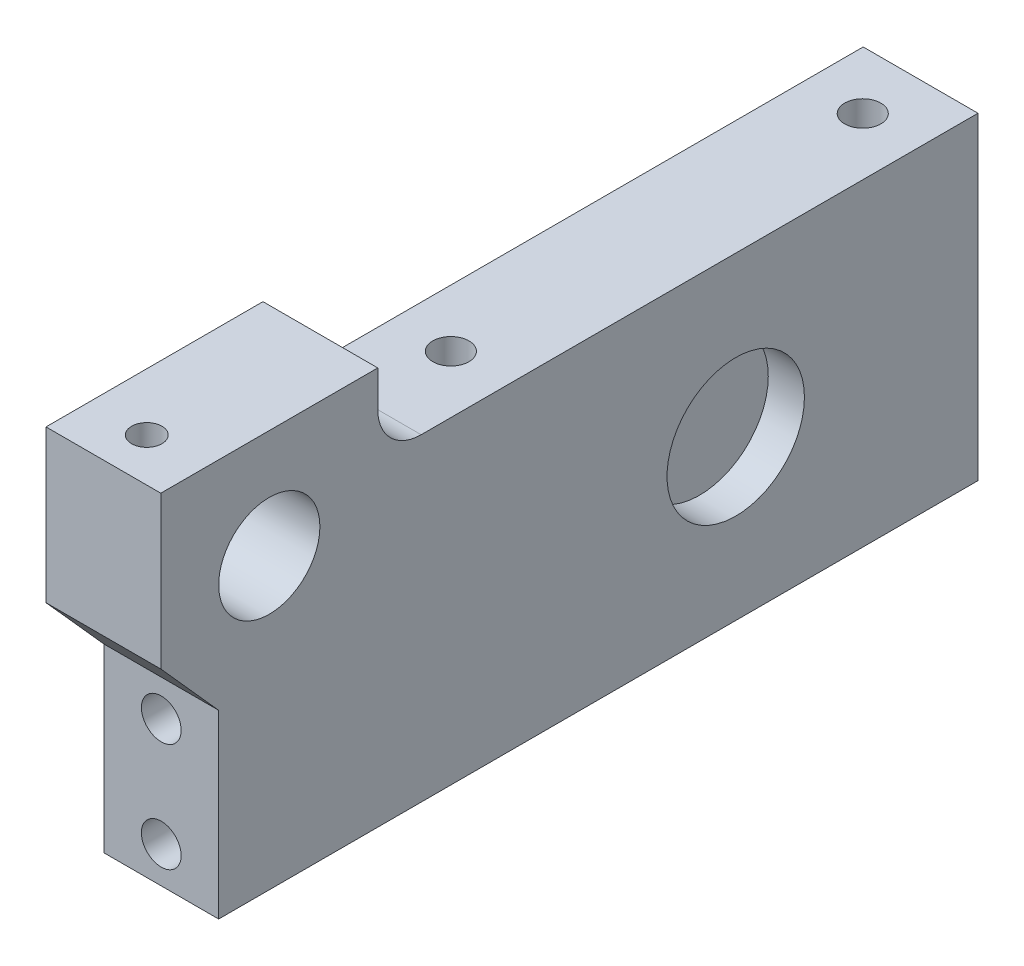
ISO-10303-21;
HEADER;
FILE_DESCRIPTION(('STEP AP214'),'2;1');
FILE_NAME('part.step','',(''),(''),'','','');
FILE_SCHEMA(('AUTOMOTIVE_DESIGN { 1 0 10303 214 1 1 1 1 }'));
ENDSEC;
DATA;
#1=APPLICATION_CONTEXT('core data for automotive mechanical design processes');
#2=APPLICATION_PROTOCOL_DEFINITION('international standard','automotive_design',2000,#1);
#3=PRODUCT_CONTEXT('',#1,'mechanical');
#4=PRODUCT('Part','Part','',(#3));
#5=PRODUCT_RELATED_PRODUCT_CATEGORY('part','',(#4));
#6=PRODUCT_DEFINITION_FORMATION('','',#4);
#7=PRODUCT_DEFINITION_CONTEXT('part definition',#1,'design');
#8=PRODUCT_DEFINITION('design','',#6,#7);
#9=PRODUCT_DEFINITION_SHAPE('','',#8);
#10=(LENGTH_UNIT() NAMED_UNIT(*) SI_UNIT(.MILLI.,.METRE.));
#11=(NAMED_UNIT(*) PLANE_ANGLE_UNIT() SI_UNIT($,.RADIAN.));
#12=(NAMED_UNIT(*) SI_UNIT($,.STERADIAN.) SOLID_ANGLE_UNIT());
#13=UNCERTAINTY_MEASURE_WITH_UNIT(LENGTH_MEASURE(1.E-05),#10,'distance_accuracy_value','');
#14=(GEOMETRIC_REPRESENTATION_CONTEXT(3) GLOBAL_UNCERTAINTY_ASSIGNED_CONTEXT((#13)) GLOBAL_UNIT_ASSIGNED_CONTEXT((#10,
#11,#12)) REPRESENTATION_CONTEXT('',''));
#15=CARTESIAN_POINT('',(0.,0.,0.));
#16=DIRECTION('',(0.,0.,1.));
#17=DIRECTION('',(1.,0.,0.));
#18=AXIS2_PLACEMENT_3D('',#15,#16,#17);
#19=CARTESIAN_POINT('',(7.9375,0.,40.));
#20=DIRECTION('',(0.,0.,1.));
#21=DIRECTION('',(1.,0.,0.));
#22=AXIS2_PLACEMENT_3D('',#19,#20,#21);
#23=PLANE('',#22);
#24=DIRECTION('',(0.,1.,0.));
#25=VECTOR('',#24,1.);
#26=CARTESIAN_POINT('',(-7.9375,0.,40.));
#27=LINE('',#26,#25);
#28=CARTESIAN_POINT('',(-7.9375,17.4442719099992,40.));
#29=VERTEX_POINT('',#28);
#30=CARTESIAN_POINT('',(-7.9375,38.5,40.));
#31=VERTEX_POINT('',#30);
#32=EDGE_CURVE('E210',#29,#31,#27,.T.);
#33=ORIENTED_EDGE('',*,*,#32,.F.);
#34=DIRECTION('',(-1.,0.,0.));
#35=VECTOR('',#34,1.);
#36=CARTESIAN_POINT('',(7.9375,17.4442719099992,40.));
#37=LINE('',#36,#35);
#38=CARTESIAN_POINT('',(7.9375,17.4442719099992,40.));
#39=VERTEX_POINT('',#38);
#40=EDGE_CURVE('E246',#39,#29,#37,.T.);
#41=ORIENTED_EDGE('',*,*,#40,.F.);
#42=DIRECTION('',(0.,1.,0.));
#43=VECTOR('',#42,1.);
#44=CARTESIAN_POINT('',(7.9375,0.,40.));
#45=LINE('',#44,#43);
#46=CARTESIAN_POINT('',(7.9375,38.5,40.));
#47=VERTEX_POINT('',#46);
#48=EDGE_CURVE('E184',#39,#47,#45,.T.);
#49=ORIENTED_EDGE('',*,*,#48,.T.);
#50=DIRECTION('',(-1.,0.,0.));
#51=VECTOR('',#50,1.);
#52=CARTESIAN_POINT('',(7.9375,38.5,40.));
#53=LINE('',#52,#51);
#54=EDGE_CURVE('E206',#47,#31,#53,.T.);
#55=ORIENTED_EDGE('',*,*,#54,.T.);
#56=EDGE_LOOP('',(#33,#41,#49,#55));
#57=FACE_BOUND('',#56,.T.);
#58=ADVANCED_FACE('F35',(#57),#23,.T.);
#59=CARTESIAN_POINT('',(7.9375,-12.1231500622207,13.5540938202782));
#60=DIRECTION('',(0.,-0.666666666666667,0.74535599249993));
#61=DIRECTION('',(0.,-0.74535599249993,-0.666666666666667));
#62=AXIS2_PLACEMENT_3D('',#59,#60,#61);
#63=PLANE('',#62);
#64=DIRECTION('',(0.,0.74535599249993,0.666666666666667));
#65=VECTOR('',#64,1.);
#66=CARTESIAN_POINT('',(-7.9375,-12.1231500622207,13.5540938202782));
#67=LINE('',#66,#65);
#68=CARTESIAN_POINT('',(-7.9375,8.5,32.));
#69=VERTEX_POINT('',#68);
#70=EDGE_CURVE('E213',#69,#29,#67,.T.);
#71=ORIENTED_EDGE('',*,*,#70,.F.);
#72=DIRECTION('',(-1.,0.,0.));
#73=VECTOR('',#72,1.);
#74=CARTESIAN_POINT('',(7.9375,8.5,32.));
#75=LINE('',#74,#73);
#76=CARTESIAN_POINT('',(7.9375,8.5,32.));
#77=VERTEX_POINT('',#76);
#78=EDGE_CURVE('E244',#77,#69,#75,.T.);
#79=ORIENTED_EDGE('',*,*,#78,.F.);
#80=DIRECTION('',(0.,0.74535599249993,0.666666666666667));
#81=VECTOR('',#80,1.);
#82=CARTESIAN_POINT('',(7.9375,-12.1231500622207,13.5540938202782));
#83=LINE('',#82,#81);
#84=EDGE_CURVE('E188',#77,#39,#83,.T.);
#85=ORIENTED_EDGE('',*,*,#84,.T.);
#86=ORIENTED_EDGE('',*,*,#40,.T.);
#87=EDGE_LOOP('',(#71,#79,#85,#86));
#88=FACE_BOUND('',#87,.T.);
#89=ADVANCED_FACE('F355',(#88),#63,.T.);
#90=CARTESIAN_POINT('',(7.9375,0.,32.));
#91=DIRECTION('',(0.,0.,-1.));
#92=DIRECTION('',(-1.,0.,0.));
#93=AXIS2_PLACEMENT_3D('',#90,#91,#92);
#94=PLANE('',#93);
#95=CARTESIAN_POINT('',(0.,3.49999999999996,32.));
#96=DIRECTION('',(0.,0.,-1.));
#97=DIRECTION('',(-1.,0.,0.));
#98=AXIS2_PLACEMENT_3D('',#95,#96,#97);
#99=CIRCLE('',#98,2.74999999999997);
#100=CARTESIAN_POINT('',(-2.74999999999997,3.49999999999996,32.));
#101=VERTEX_POINT('',#100);
#102=EDGE_CURVE('E176',#101,#101,#99,.T.);
#103=ORIENTED_EDGE('',*,*,#102,.T.);
#104=EDGE_LOOP('',(#103));
#105=FACE_BOUND('',#104,.T.);
#106=CARTESIAN_POINT('',(0.,-11.5,32.));
#107=DIRECTION('',(0.,0.,-1.));
#108=DIRECTION('',(-1.,0.,0.));
#109=AXIS2_PLACEMENT_3D('',#106,#107,#108);
#110=CIRCLE('',#109,2.74999999999997);
#111=CARTESIAN_POINT('',(-2.74999999999997,-11.5,32.));
#112=VERTEX_POINT('',#111);
#113=EDGE_CURVE('E180',#112,#112,#110,.T.);
#114=ORIENTED_EDGE('',*,*,#113,.T.);
#115=EDGE_LOOP('',(#114));
#116=FACE_BOUND('',#115,.T.);
#117=DIRECTION('',(0.,-1.,0.));
#118=VECTOR('',#117,1.);
#119=CARTESIAN_POINT('',(-7.9375,0.,32.));
#120=LINE('',#119,#118);
#121=CARTESIAN_POINT('',(-7.9375,-16.5,32.));
#122=VERTEX_POINT('',#121);
#123=EDGE_CURVE('E216',#69,#122,#120,.T.);
#124=ORIENTED_EDGE('',*,*,#123,.T.);
#125=DIRECTION('',(-1.,0.,0.));
#126=VECTOR('',#125,1.);
#127=CARTESIAN_POINT('',(7.9375,-16.5,32.));
#128=LINE('',#127,#126);
#129=CARTESIAN_POINT('',(7.9375,-16.5,32.));
#130=VERTEX_POINT('',#129);
#131=EDGE_CURVE('E241',#130,#122,#128,.T.);
#132=ORIENTED_EDGE('',*,*,#131,.F.);
#133=DIRECTION('',(0.,-1.,0.));
#134=VECTOR('',#133,1.);
#135=CARTESIAN_POINT('',(7.9375,0.,32.));
#136=LINE('',#135,#134);
#137=EDGE_CURVE('E191',#77,#130,#136,.T.);
#138=ORIENTED_EDGE('',*,*,#137,.F.);
#139=ORIENTED_EDGE('',*,*,#78,.T.);
#140=EDGE_LOOP('',(#124,#132,#138,#139));
#141=FACE_BOUND('',#140,.T.);
#142=ADVANCED_FACE('F351',(#105,#116,#141),#94,.F.);
#143=CARTESIAN_POINT('',(7.9375,-16.5,0.));
#144=DIRECTION('',(0.,1.,0.));
#145=DIRECTION('',(0.,0.,1.));
#146=AXIS2_PLACEMENT_3D('',#143,#144,#145);
#147=PLANE('',#146);
#148=CARTESIAN_POINT('',(0.00250000000007189,-16.5,-65.));
#149=DIRECTION('',(0.,1.,0.));
#150=DIRECTION('',(0.,0.,1.));
#151=AXIS2_PLACEMENT_3D('',#148,#149,#150);
#152=CIRCLE('',#151,3.29999999999999);
#153=CARTESIAN_POINT('',(0.00250000000007189,-16.5,-61.7));
#154=VERTEX_POINT('',#153);
#155=EDGE_CURVE('E168',#154,#154,#152,.T.);
#156=ORIENTED_EDGE('',*,*,#155,.T.);
#157=EDGE_LOOP('',(#156));
#158=FACE_BOUND('',#157,.T.);
#159=CARTESIAN_POINT('',(0.00250000000007883,-16.5,-8.04672113487742));
#160=DIRECTION('',(0.,1.,0.));
#161=DIRECTION('',(0.,0.,1.));
#162=AXIS2_PLACEMENT_3D('',#159,#160,#161);
#163=CIRCLE('',#162,3.29999999999999);
#164=CARTESIAN_POINT('',(0.00250000000007883,-16.5,-4.74672113487743));
#165=VERTEX_POINT('',#164);
#166=EDGE_CURVE('E172',#165,#165,#163,.T.);
#167=ORIENTED_EDGE('',*,*,#166,.T.);
#168=EDGE_LOOP('',(#167));
#169=FACE_BOUND('',#168,.T.);
#170=DIRECTION('',(0.,0.,-1.));
#171=VECTOR('',#170,1.);
#172=CARTESIAN_POINT('',(-7.9375,-16.5,0.));
#173=LINE('',#172,#171);
#174=CARTESIAN_POINT('',(-7.9375,-16.5,-73.));
#175=VERTEX_POINT('',#174);
#176=EDGE_CURVE('E219',#122,#175,#173,.T.);
#177=ORIENTED_EDGE('',*,*,#176,.T.);
#178=DIRECTION('',(-1.,0.,0.));
#179=VECTOR('',#178,1.);
#180=CARTESIAN_POINT('',(7.9375,-16.5,-73.));
#181=LINE('',#180,#179);
#182=CARTESIAN_POINT('',(7.9375,-16.5,-73.));
#183=VERTEX_POINT('',#182);
#184=EDGE_CURVE('E238',#183,#175,#181,.T.);
#185=ORIENTED_EDGE('',*,*,#184,.F.);
#186=DIRECTION('',(0.,0.,-1.));
#187=VECTOR('',#186,1.);
#188=CARTESIAN_POINT('',(7.9375,-16.5,0.));
#189=LINE('',#188,#187);
#190=EDGE_CURVE('E194',#130,#183,#189,.T.);
#191=ORIENTED_EDGE('',*,*,#190,.F.);
#192=ORIENTED_EDGE('',*,*,#131,.T.);
#193=EDGE_LOOP('',(#177,#185,#191,#192));
#194=FACE_BOUND('',#193,.T.);
#195=ADVANCED_FACE('F347',(#158,#169,#194),#147,.F.);
#196=CARTESIAN_POINT('',(7.9375,0.,-73.));
#197=DIRECTION('',(0.,0.,1.));
#198=DIRECTION('',(1.,0.,0.));
#199=AXIS2_PLACEMENT_3D('',#196,#197,#198);
#200=PLANE('',#199);
#201=DIRECTION('',(0.,1.,0.));
#202=VECTOR('',#201,1.);
#203=CARTESIAN_POINT('',(-7.9375,0.,-73.));
#204=LINE('',#203,#202);
#205=CARTESIAN_POINT('',(-7.9375,27.5,-73.));
#206=VERTEX_POINT('',#205);
#207=EDGE_CURVE('E222',#175,#206,#204,.T.);
#208=ORIENTED_EDGE('',*,*,#207,.T.);
#209=DIRECTION('',(-1.,0.,0.));
#210=VECTOR('',#209,1.);
#211=CARTESIAN_POINT('',(7.9375,27.5,-73.));
#212=LINE('',#211,#210);
#213=CARTESIAN_POINT('',(7.9375,27.5,-73.));
#214=VERTEX_POINT('',#213);
#215=EDGE_CURVE('E235',#214,#206,#212,.T.);
#216=ORIENTED_EDGE('',*,*,#215,.F.);
#217=DIRECTION('',(0.,1.,0.));
#218=VECTOR('',#217,1.);
#219=CARTESIAN_POINT('',(7.9375,0.,-73.));
#220=LINE('',#219,#218);
#221=EDGE_CURVE('E197',#183,#214,#220,.T.);
#222=ORIENTED_EDGE('',*,*,#221,.F.);
#223=ORIENTED_EDGE('',*,*,#184,.T.);
#224=EDGE_LOOP('',(#208,#216,#222,#223));
#225=FACE_BOUND('',#224,.T.);
#226=ADVANCED_FACE('F343',(#225),#200,.F.);
#227=CARTESIAN_POINT('',(7.9375,27.5,0.));
#228=DIRECTION('',(0.,1.,0.));
#229=DIRECTION('',(0.,0.,1.));
#230=AXIS2_PLACEMENT_3D('',#227,#228,#229);
#231=PLANE('',#230);
#232=CARTESIAN_POINT('',(0.00250000000002332,27.5,-65.));
#233=DIRECTION('',(0.,1.,0.));
#234=DIRECTION('',(0.,0.,1.));
#235=AXIS2_PLACEMENT_3D('',#232,#233,#234);
#236=CIRCLE('',#235,2.5);
#237=CARTESIAN_POINT('',(0.00250000000002332,27.5,-62.5));
#238=VERTEX_POINT('',#237);
#239=EDGE_CURVE('E145',#238,#238,#236,.T.);
#240=ORIENTED_EDGE('',*,*,#239,.F.);
#241=EDGE_LOOP('',(#240));
#242=FACE_BOUND('',#241,.T.);
#243=CARTESIAN_POINT('',(0.00250000000007883,27.5,-8.04672113488112));
#244=DIRECTION('',(0.,1.,0.));
#245=DIRECTION('',(0.,0.,1.));
#246=AXIS2_PLACEMENT_3D('',#243,#244,#245);
#247=CIRCLE('',#246,2.5);
#248=CARTESIAN_POINT('',(0.00250000000007883,27.5,-5.54672113488112));
#249=VERTEX_POINT('',#248);
#250=EDGE_CURVE('E144',#249,#249,#247,.T.);
#251=ORIENTED_EDGE('',*,*,#250,.F.);
#252=EDGE_LOOP('',(#251));
#253=FACE_BOUND('',#252,.T.);
#254=DIRECTION('',(0.,0.,-1.));
#255=VECTOR('',#254,1.);
#256=CARTESIAN_POINT('',(-7.9375,27.5,0.));
#257=LINE('',#256,#255);
#258=CARTESIAN_POINT('',(-7.9375,27.5,4.00000000000002));
#259=VERTEX_POINT('',#258);
#260=EDGE_CURVE('E225',#259,#206,#257,.T.);
#261=ORIENTED_EDGE('',*,*,#260,.F.);
#262=DIRECTION('',(-1.,0.,0.));
#263=VECTOR('',#262,1.);
#264=CARTESIAN_POINT('',(7.9375,27.5,4.00000000000002));
#265=LINE('',#264,#263);
#266=CARTESIAN_POINT('',(7.9375,27.5,4.00000000000002));
#267=VERTEX_POINT('',#266);
#268=EDGE_CURVE('E51',#259,#267,#265,.F.);
#269=ORIENTED_EDGE('',*,*,#268,.T.);
#270=DIRECTION('',(0.,0.,-1.));
#271=VECTOR('',#270,1.);
#272=CARTESIAN_POINT('',(7.9375,27.5,0.));
#273=LINE('',#272,#271);
#274=EDGE_CURVE('E200',#267,#214,#273,.T.);
#275=ORIENTED_EDGE('',*,*,#274,.T.);
#276=ORIENTED_EDGE('',*,*,#215,.T.);
#277=EDGE_LOOP('',(#261,#269,#275,#276));
#278=FACE_BOUND('',#277,.T.);
#279=ADVANCED_FACE('F339',(#242,#253,#278),#231,.T.);
#280=CARTESIAN_POINT('',(7.9375,0.,10.));
#281=DIRECTION('',(0.,0.,1.));
#282=DIRECTION('',(1.,0.,0.));
#283=AXIS2_PLACEMENT_3D('',#280,#281,#282);
#284=PLANE('',#283);
#285=DIRECTION('',(0.,1.,0.));
#286=VECTOR('',#285,1.);
#287=CARTESIAN_POINT('',(7.9375,0.,10.));
#288=LINE('',#287,#286);
#289=CARTESIAN_POINT('',(7.9375,33.5,10.));
#290=VERTEX_POINT('',#289);
#291=CARTESIAN_POINT('',(7.9375,38.5,10.));
#292=VERTEX_POINT('',#291);
#293=EDGE_CURVE('E202',#290,#292,#288,.T.);
#294=ORIENTED_EDGE('',*,*,#293,.F.);
#295=DIRECTION('',(-1.,0.,0.));
#296=VECTOR('',#295,1.);
#297=CARTESIAN_POINT('',(7.9375,33.5,10.));
#298=LINE('',#297,#296);
#299=CARTESIAN_POINT('',(2.09749999999999,33.5,10.));
#300=VERTEX_POINT('',#299);
#301=EDGE_CURVE('E262',#290,#300,#298,.T.);
#302=ORIENTED_EDGE('',*,*,#301,.T.);
#303=CARTESIAN_POINT('',(-0.0025000000000025,33.5000000000002,10.));
#304=DIRECTION('',(0.,0.,1.));
#305=DIRECTION('',(1.,0.,0.));
#306=AXIS2_PLACEMENT_3D('',#303,#304,#305);
#307=CIRCLE('',#306,2.09999999999999);
#308=CARTESIAN_POINT('',(-2.1025,33.5,10.));
#309=VERTEX_POINT('',#308);
#310=EDGE_CURVE('E160',#300,#309,#307,.T.);
#311=ORIENTED_EDGE('',*,*,#310,.T.);
#312=DIRECTION('',(-1.,0.,0.));
#313=VECTOR('',#312,1.);
#314=CARTESIAN_POINT('',(7.9375,33.5,10.));
#315=LINE('',#314,#313);
#316=CARTESIAN_POINT('',(-7.9375,33.5,10.));
#317=VERTEX_POINT('',#316);
#318=EDGE_CURVE('E248',#309,#317,#315,.T.);
#319=ORIENTED_EDGE('',*,*,#318,.T.);
#320=DIRECTION('',(0.,1.,0.));
#321=VECTOR('',#320,1.);
#322=CARTESIAN_POINT('',(-7.9375,0.,10.));
#323=LINE('',#322,#321);
#324=CARTESIAN_POINT('',(-7.9375,38.5,10.));
#325=VERTEX_POINT('',#324);
#326=EDGE_CURVE('E227',#317,#325,#323,.T.);
#327=ORIENTED_EDGE('',*,*,#326,.T.);
#328=DIRECTION('',(-1.,0.,0.));
#329=VECTOR('',#328,1.);
#330=CARTESIAN_POINT('',(7.9375,38.5,10.));
#331=LINE('',#330,#329);
#332=EDGE_CURVE('E232',#292,#325,#331,.T.);
#333=ORIENTED_EDGE('',*,*,#332,.F.);
#334=EDGE_LOOP('',(#294,#302,#311,#319,#327,#333));
#335=FACE_BOUND('',#334,.T.);
#336=ADVANCED_FACE('F336',(#335),#284,.F.);
#337=CARTESIAN_POINT('',(7.9375,23.5,25.));
#338=DIRECTION('',(-1.,0.,0.));
#339=DIRECTION('',(0.,0.,1.));
#340=AXIS2_PLACEMENT_3D('',#337,#338,#339);
#341=CYLINDRICAL_SURFACE('',#340,7.);
#342=CARTESIAN_POINT('',(7.9375,23.5,25.));
#343=DIRECTION('',(1.,0.,0.));
#344=DIRECTION('',(0.,0.,-1.));
#345=AXIS2_PLACEMENT_3D('',#342,#343,#344);
#346=CIRCLE('',#345,7.);
#347=CARTESIAN_POINT('',(7.9375,23.5,18.));
#348=VERTEX_POINT('',#347);
#349=EDGE_CURVE('E181',#348,#348,#346,.T.);
#350=ORIENTED_EDGE('',*,*,#349,.T.);
#351=EDGE_LOOP('',(#350));
#352=FACE_BOUND('',#351,.T.);
#353=CARTESIAN_POINT('',(-7.9375,23.5,25.));
#354=DIRECTION('',(1.,0.,0.));
#355=DIRECTION('',(0.,0.,-1.));
#356=AXIS2_PLACEMENT_3D('',#353,#354,#355);
#357=CIRCLE('',#356,7.);
#358=CARTESIAN_POINT('',(-7.9375,23.5,18.));
#359=VERTEX_POINT('',#358);
#360=EDGE_CURVE('E207',#359,#359,#357,.T.);
#361=ORIENTED_EDGE('',*,*,#360,.F.);
#362=EDGE_LOOP('',(#361));
#363=FACE_BOUND('',#362,.T.);
#364=ADVANCED_FACE('F334',(#352,#363),#341,.F.);
#365=CARTESIAN_POINT('',(7.9375,38.5,0.));
#366=DIRECTION('',(0.,-1.,0.));
#367=DIRECTION('',(0.,0.,-1.));
#368=AXIS2_PLACEMENT_3D('',#365,#366,#367);
#369=PLANE('',#368);
#370=CARTESIAN_POINT('',(-0.00249999999991229,38.5,33.9999999999961));
#371=DIRECTION('',(0.,-1.,0.));
#372=DIRECTION('',(0.,0.,-1.));
#373=AXIS2_PLACEMENT_3D('',#370,#371,#372);
#374=CIRCLE('',#373,2.09999999999999);
#375=CARTESIAN_POINT('',(-0.00249999999991229,38.5,31.8999999999961));
#376=VERTEX_POINT('',#375);
#377=EDGE_CURVE('E164',#376,#376,#374,.T.);
#378=ORIENTED_EDGE('',*,*,#377,.T.);
#379=EDGE_LOOP('',(#378));
#380=FACE_BOUND('',#379,.T.);
#381=DIRECTION('',(0.,0.,1.));
#382=VECTOR('',#381,1.);
#383=CARTESIAN_POINT('',(-7.9375,38.5,0.));
#384=LINE('',#383,#382);
#385=EDGE_CURVE('E185',#325,#31,#384,.T.);
#386=ORIENTED_EDGE('',*,*,#385,.T.);
#387=ORIENTED_EDGE('',*,*,#54,.F.);
#388=DIRECTION('',(0.,0.,1.));
#389=VECTOR('',#388,1.);
#390=CARTESIAN_POINT('',(7.9375,38.5,0.));
#391=LINE('',#390,#389);
#392=EDGE_CURVE('E204',#292,#47,#391,.T.);
#393=ORIENTED_EDGE('',*,*,#392,.F.);
#394=ORIENTED_EDGE('',*,*,#332,.T.);
#395=EDGE_LOOP('',(#386,#387,#393,#394));
#396=FACE_BOUND('',#395,.T.);
#397=ADVANCED_FACE('F327',(#380,#396),#369,.F.);
#398=CARTESIAN_POINT('',(7.9375,0.,0.));
#399=DIRECTION('',(1.,0.,0.));
#400=DIRECTION('',(0.,0.,-1.));
#401=AXIS2_PLACEMENT_3D('',#398,#399,#400);
#402=PLANE('',#401);
#403=CARTESIAN_POINT('',(7.9375,5.5,-39.5));
#404=DIRECTION('',(1.,0.,0.));
#405=DIRECTION('',(0.,0.,-1.));
#406=AXIS2_PLACEMENT_3D('',#403,#404,#405);
#407=CIRCLE('',#406,9.5);
#408=CARTESIAN_POINT('',(7.9375,5.5,-49.));
#409=VERTEX_POINT('',#408);
#410=EDGE_CURVE('E561',#409,#409,#407,.T.);
#411=ORIENTED_EDGE('',*,*,#410,.F.);
#412=EDGE_LOOP('',(#411));
#413=FACE_BOUND('',#412,.T.);
#414=ORIENTED_EDGE('',*,*,#349,.F.);
#415=EDGE_LOOP('',(#414));
#416=FACE_BOUND('',#415,.T.);
#417=ORIENTED_EDGE('',*,*,#48,.F.);
#418=ORIENTED_EDGE('',*,*,#84,.F.);
#419=ORIENTED_EDGE('',*,*,#137,.T.);
#420=ORIENTED_EDGE('',*,*,#190,.T.);
#421=ORIENTED_EDGE('',*,*,#221,.T.);
#422=ORIENTED_EDGE('',*,*,#274,.F.);
#423=CARTESIAN_POINT('',(7.9375,33.5,4.00000000000002));
#424=DIRECTION('',(1.,0.,0.));
#425=DIRECTION('',(0.,0.,-1.));
#426=AXIS2_PLACEMENT_3D('',#423,#424,#425);
#427=CIRCLE('',#426,6.);
#428=EDGE_CURVE('E11',#267,#290,#427,.F.);
#429=ORIENTED_EDGE('',*,*,#428,.T.);
#430=ORIENTED_EDGE('',*,*,#293,.T.);
#431=ORIENTED_EDGE('',*,*,#392,.T.);
#432=EDGE_LOOP('',(#417,#418,#419,#420,#421,#422,#429,#430,#431));
#433=FACE_BOUND('',#432,.T.);
#434=ADVANCED_FACE('F324',(#413,#416,#433),#402,.T.);
#435=CARTESIAN_POINT('',(-7.9375,0.,0.));
#436=DIRECTION('',(1.,0.,0.));
#437=DIRECTION('',(0.,0.,-1.));
#438=AXIS2_PLACEMENT_3D('',#435,#436,#437);
#439=PLANE('',#438);
#440=ORIENTED_EDGE('',*,*,#360,.T.);
#441=EDGE_LOOP('',(#440));
#442=FACE_BOUND('',#441,.T.);
#443=ORIENTED_EDGE('',*,*,#32,.T.);
#444=ORIENTED_EDGE('',*,*,#385,.F.);
#445=ORIENTED_EDGE('',*,*,#326,.F.);
#446=CARTESIAN_POINT('',(-7.9375,33.5,4.00000000000002));
#447=DIRECTION('',(1.,0.,0.));
#448=DIRECTION('',(0.,0.,-1.));
#449=AXIS2_PLACEMENT_3D('',#446,#447,#448);
#450=CIRCLE('',#449,6.);
#451=EDGE_CURVE('E44',#317,#259,#450,.T.);
#452=ORIENTED_EDGE('',*,*,#451,.T.);
#453=ORIENTED_EDGE('',*,*,#260,.T.);
#454=ORIENTED_EDGE('',*,*,#207,.F.);
#455=ORIENTED_EDGE('',*,*,#176,.F.);
#456=ORIENTED_EDGE('',*,*,#123,.F.);
#457=ORIENTED_EDGE('',*,*,#70,.T.);
#458=EDGE_LOOP('',(#443,#444,#445,#452,#453,#454,#455,#456,#457));
#459=FACE_BOUND('',#458,.T.);
#460=ADVANCED_FACE('F319',(#442,#459),#439,.F.);
#461=CARTESIAN_POINT('',(0.,-11.5,40.0703998949895));
#462=DIRECTION('',(0.,0.,1.));
#463=DIRECTION('',(1.,0.,0.));
#464=AXIS2_PLACEMENT_3D('',#461,#462,#463);
#465=CYLINDRICAL_SURFACE('',#464,2.74999999999997);
#466=CARTESIAN_POINT('',(0.,-11.5,10.0703998949895));
#467=DIRECTION('',(0.,0.,1.));
#468=DIRECTION('',(1.,0.,0.));
#469=AXIS2_PLACEMENT_3D('',#466,#467,#468);
#470=CIRCLE('',#469,2.74999999999997);
#471=CARTESIAN_POINT('',(2.74999999999997,-11.5,10.0703998949895));
#472=VERTEX_POINT('',#471);
#473=EDGE_CURVE('E177',#472,#472,#470,.T.);
#474=ORIENTED_EDGE('',*,*,#473,.F.);
#475=EDGE_LOOP('',(#474));
#476=FACE_BOUND('',#475,.T.);
#477=ORIENTED_EDGE('',*,*,#113,.F.);
#478=EDGE_LOOP('',(#477));
#479=FACE_BOUND('',#478,.T.);
#480=ADVANCED_FACE('F316',(#476,#479),#465,.F.);
#481=CARTESIAN_POINT('',(0.,-11.5,10.0703998949895));
#482=DIRECTION('',(0.,0.,1.));
#483=DIRECTION('',(1.,0.,0.));
#484=AXIS2_PLACEMENT_3D('',#481,#482,#483);
#485=CONICAL_SURFACE('',#484,2.74999999999997,1.02974425867665);
#486=CARTESIAN_POINT('',(0.,-11.5,8.41803319266368));
#487=VERTEX_POINT('',#486);
#488=VERTEX_LOOP('',#487);
#489=FACE_BOUND('',#488,.T.);
#490=ORIENTED_EDGE('',*,*,#473,.T.);
#491=EDGE_LOOP('',(#490));
#492=FACE_BOUND('',#491,.T.);
#493=ADVANCED_FACE('F311',(#489,#492),#485,.F.);
#494=CARTESIAN_POINT('',(0.,3.49999999999996,40.0703998949895));
#495=DIRECTION('',(0.,0.,1.));
#496=DIRECTION('',(1.,0.,0.));
#497=AXIS2_PLACEMENT_3D('',#494,#495,#496);
#498=CYLINDRICAL_SURFACE('',#497,2.74999999999997);
#499=CARTESIAN_POINT('',(0.,3.49999999999996,10.0703998949895));
#500=DIRECTION('',(0.,0.,1.));
#501=DIRECTION('',(1.,0.,0.));
#502=AXIS2_PLACEMENT_3D('',#499,#500,#501);
#503=CIRCLE('',#502,2.74999999999997);
#504=CARTESIAN_POINT('',(2.74999999999997,3.49999999999996,10.0703998949895));
#505=VERTEX_POINT('',#504);
#506=EDGE_CURVE('E173',#505,#505,#503,.T.);
#507=ORIENTED_EDGE('',*,*,#506,.F.);
#508=EDGE_LOOP('',(#507));
#509=FACE_BOUND('',#508,.T.);
#510=ORIENTED_EDGE('',*,*,#102,.F.);
#511=EDGE_LOOP('',(#510));
#512=FACE_BOUND('',#511,.T.);
#513=ADVANCED_FACE('F308',(#509,#512),#498,.F.);
#514=CARTESIAN_POINT('',(0.,3.49999999999996,10.0703998949895));
#515=DIRECTION('',(0.,0.,1.));
#516=DIRECTION('',(1.,0.,0.));
#517=AXIS2_PLACEMENT_3D('',#514,#515,#516);
#518=CONICAL_SURFACE('',#517,2.74999999999997,1.02974425867665);
#519=CARTESIAN_POINT('',(0.,3.49999999999996,8.41803319266368));
#520=VERTEX_POINT('',#519);
#521=VERTEX_LOOP('',#520);
#522=FACE_BOUND('',#521,.T.);
#523=ORIENTED_EDGE('',*,*,#506,.T.);
#524=EDGE_LOOP('',(#523));
#525=FACE_BOUND('',#524,.T.);
#526=ADVANCED_FACE('F303',(#522,#525),#518,.F.);
#527=CARTESIAN_POINT('',(0.00250000000007883,-23.5000000000002,-8.04672113487742));
#528=DIRECTION('',(0.,-1.,0.));
#529=DIRECTION('',(0.,0.,-1.));
#530=AXIS2_PLACEMENT_3D('',#527,#528,#529);
#531=CYLINDRICAL_SURFACE('',#530,3.29999999999999);
#532=CARTESIAN_POINT('',(0.00250000000007883,6.49999999999978,-8.04672113487742));
#533=DIRECTION('',(0.,-1.,0.));
#534=DIRECTION('',(0.,0.,-1.));
#535=AXIS2_PLACEMENT_3D('',#532,#533,#534);
#536=CIRCLE('',#535,3.29999999999999);
#537=CARTESIAN_POINT('',(0.00250000000007883,6.49999999999978,-11.3467211348774));
#538=VERTEX_POINT('',#537);
#539=EDGE_CURVE('E169',#538,#538,#536,.T.);
#540=ORIENTED_EDGE('',*,*,#539,.F.);
#541=EDGE_LOOP('',(#540));
#542=FACE_BOUND('',#541,.T.);
#543=ORIENTED_EDGE('',*,*,#166,.F.);
#544=EDGE_LOOP('',(#543));
#545=FACE_BOUND('',#544,.T.);
#546=ADVANCED_FACE('F300',(#542,#545),#531,.F.);
#547=CARTESIAN_POINT('',(0.00250000000007883,6.49999999999978,-8.04672113487742));
#548=DIRECTION('',(0.,-1.,0.));
#549=DIRECTION('',(0.,0.,-1.));
#550=AXIS2_PLACEMENT_3D('',#547,#548,#549);
#551=CONICAL_SURFACE('',#550,3.29999999999999,1.02974425867665);
#552=CARTESIAN_POINT('',(0.00250000000007087,8.48284004279073,-8.04672113487742));
#553=VERTEX_POINT('',#552);
#554=VERTEX_LOOP('',#553);
#555=FACE_BOUND('',#554,.T.);
#556=ORIENTED_EDGE('',*,*,#539,.T.);
#557=EDGE_LOOP('',(#556));
#558=FACE_BOUND('',#557,.T.);
#559=ADVANCED_FACE('F295',(#555,#558),#551,.F.);
#560=CARTESIAN_POINT('',(0.00250000000007189,-23.5000000000002,-65.));
#561=DIRECTION('',(0.,-1.,0.));
#562=DIRECTION('',(0.,0.,-1.));
#563=AXIS2_PLACEMENT_3D('',#560,#561,#562);
#564=CYLINDRICAL_SURFACE('',#563,3.29999999999999);
#565=CARTESIAN_POINT('',(0.00250000000007189,6.49999999999977,-65.));
#566=DIRECTION('',(0.,-1.,0.));
#567=DIRECTION('',(0.,0.,-1.));
#568=AXIS2_PLACEMENT_3D('',#565,#566,#567);
#569=CIRCLE('',#568,3.29999999999999);
#570=CARTESIAN_POINT('',(0.00250000000007189,6.49999999999977,-68.3));
#571=VERTEX_POINT('',#570);
#572=EDGE_CURVE('E165',#571,#571,#569,.T.);
#573=ORIENTED_EDGE('',*,*,#572,.F.);
#574=EDGE_LOOP('',(#573));
#575=FACE_BOUND('',#574,.T.);
#576=ORIENTED_EDGE('',*,*,#155,.F.);
#577=EDGE_LOOP('',(#576));
#578=FACE_BOUND('',#577,.T.);
#579=ADVANCED_FACE('F292',(#575,#578),#564,.F.);
#580=CARTESIAN_POINT('',(0.00250000000007189,6.49999999999977,-65.));
#581=DIRECTION('',(0.,-1.,0.));
#582=DIRECTION('',(0.,0.,-1.));
#583=AXIS2_PLACEMENT_3D('',#580,#581,#582);
#584=CONICAL_SURFACE('',#583,3.29999999999999,1.02974425867665);
#585=CARTESIAN_POINT('',(0.00250000000006393,8.48284004279072,-65.));
#586=VERTEX_POINT('',#585);
#587=VERTEX_LOOP('',#586);
#588=FACE_BOUND('',#587,.T.);
#589=ORIENTED_EDGE('',*,*,#572,.T.);
#590=EDGE_LOOP('',(#589));
#591=FACE_BOUND('',#590,.T.);
#592=ADVANCED_FACE('F287',(#588,#591),#584,.F.);
#593=CARTESIAN_POINT('',(-0.00249999999991229,48.5,33.9999999999961));
#594=DIRECTION('',(0.,1.,0.));
#595=DIRECTION('',(0.,0.,1.));
#596=AXIS2_PLACEMENT_3D('',#593,#594,#595);
#597=CYLINDRICAL_SURFACE('',#596,2.09999999999999);
#598=CARTESIAN_POINT('',(-0.00249999999991229,28.5,33.9999999999961));
#599=DIRECTION('',(0.,1.,0.));
#600=DIRECTION('',(0.,0.,1.));
#601=AXIS2_PLACEMENT_3D('',#598,#599,#600);
#602=CIRCLE('',#601,2.1);
#603=CARTESIAN_POINT('',(-0.00249999999991229,28.5,36.0999999999961));
#604=VERTEX_POINT('',#603);
#605=EDGE_CURVE('E161',#604,#604,#602,.T.);
#606=ORIENTED_EDGE('',*,*,#605,.F.);
#607=EDGE_LOOP('',(#606));
#608=FACE_BOUND('',#607,.T.);
#609=ORIENTED_EDGE('',*,*,#377,.F.);
#610=EDGE_LOOP('',(#609));
#611=FACE_BOUND('',#610,.T.);
#612=ADVANCED_FACE('F284',(#608,#611),#597,.F.);
#613=CARTESIAN_POINT('',(-0.00249999999991229,28.5,33.9999999999961));
#614=DIRECTION('',(0.,1.,0.));
#615=DIRECTION('',(0.,0.,1.));
#616=AXIS2_PLACEMENT_3D('',#613,#614,#615);
#617=CONICAL_SURFACE('',#616,2.1,1.02974425867665);
#618=CARTESIAN_POINT('',(-0.0024999999999175,27.2381927000421,33.9999999999961));
#619=VERTEX_POINT('',#618);
#620=VERTEX_LOOP('',#619);
#621=FACE_BOUND('',#620,.T.);
#622=ORIENTED_EDGE('',*,*,#605,.T.);
#623=EDGE_LOOP('',(#622));
#624=FACE_BOUND('',#623,.T.);
#625=ADVANCED_FACE('F277',(#621,#624),#617,.F.);
#626=CARTESIAN_POINT('',(-0.0025000000000025,33.5000000000002,-1.88217497143484E-12));
#627=DIRECTION('',(0.,0.,-1.));
#628=DIRECTION('',(-1.,0.,0.));
#629=AXIS2_PLACEMENT_3D('',#626,#627,#628);
#630=CYLINDRICAL_SURFACE('',#629,2.09999999999999);
#631=CARTESIAN_POINT('',(-0.0025000000000025,33.5000000000002,19.9999999999981));
#632=DIRECTION('',(0.,0.,-1.));
#633=DIRECTION('',(-1.,0.,0.));
#634=AXIS2_PLACEMENT_3D('',#631,#632,#633);
#635=CIRCLE('',#634,2.1);
#636=CARTESIAN_POINT('',(-2.1025,33.5000000000002,19.9999999999981));
#637=VERTEX_POINT('',#636);
#638=EDGE_CURVE('E157',#637,#637,#635,.T.);
#639=ORIENTED_EDGE('',*,*,#638,.F.);
#640=EDGE_LOOP('',(#639));
#641=FACE_BOUND('',#640,.T.);
#642=ORIENTED_EDGE('',*,*,#310,.F.);
#643=CARTESIAN_POINT('',(2.09749999999999,33.5,10.));
#644=CARTESIAN_POINT('',(2.09750749213628,33.4427822709449,10.000007635064));
#645=CARTESIAN_POINT('',(2.09516167748065,33.3855693053025,9.99918171540999));
#646=CARTESIAN_POINT('',(2.08582161361069,33.2715839491997,9.99591962310174));
#647=CARTESIAN_POINT('',(2.07882850645092,33.2148114539623,9.99348384606468));
#648=CARTESIAN_POINT('',(2.06027879965878,33.1022722537331,9.98706811827299));
#649=CARTESIAN_POINT('',(2.04873543335329,33.0465031181755,9.98309264593014));
#650=CARTESIAN_POINT('',(2.02120368889562,32.9362107125334,9.97370997225443));
#651=CARTESIAN_POINT('',(2.00521517941558,32.8816874793095,9.96830272862137));
#652=CARTESIAN_POINT('',(1.95079171375825,32.7206000054442,9.95013944676012));
#653=CARTESIAN_POINT('',(1.90587300736754,32.6163632903303,9.93543246793279));
#654=CARTESIAN_POINT('',(1.80020094465462,32.4169313031462,9.90230675419578));
#655=CARTESIAN_POINT('',(1.73943878343123,32.3217410988825,9.88388595664961));
#656=CARTESIAN_POINT('',(1.6014052590086,32.1394911860299,9.84448425898291));
#657=CARTESIAN_POINT('',(1.52364511224037,32.0528152600868,9.82343785194531));
#658=CARTESIAN_POINT('',(1.35486092908148,31.8934341092261,9.78150105800193));
#659=CARTESIAN_POINT('',(1.26383309806765,31.8207328949852,9.76061071753493));
#660=CARTESIAN_POINT('',(1.06750527193271,31.6890612875752,9.72061172861625));
#661=CARTESIAN_POINT('',(0.961839397617751,31.6306099338279,9.70158237005371));
#662=CARTESIAN_POINT('',(0.741408567749484,31.5324786913616,9.6684708889599));
#663=CARTESIAN_POINT('',(0.62664710308165,31.4927916412532,9.65438687956696));
#664=CARTESIAN_POINT('',(0.39569534274358,31.4347904806895,9.63345672404915));
#665=CARTESIAN_POINT('',(0.279711228387694,31.4157469903568,9.6263644398709));
#666=CARTESIAN_POINT('',(0.0459913263004329,31.397292796438,9.61949542795588));
#667=CARTESIAN_POINT('',(-0.071743875652027,31.397875668744,9.61971630647169));
#668=CARTESIAN_POINT('',(-0.299230399771097,31.4180954647383,9.62723458484967));
#669=CARTESIAN_POINT('',(-0.409082424187433,31.4367579479877,9.63417007389119));
#670=CARTESIAN_POINT('',(-0.623982817986547,31.4910090210003,9.65374019188535));
#671=CARTESIAN_POINT('',(-0.729030617392185,31.5265996134472,9.66637549514663));
#672=CARTESIAN_POINT('',(-0.933467535719401,31.6142937991726,9.69616368164759));
#673=CARTESIAN_POINT('',(-1.0327275519613,31.6666720334271,9.71339083539152));
#674=CARTESIAN_POINT('',(-1.22134738491663,31.786264119796,9.75039292324241));
#675=CARTESIAN_POINT('',(-1.31070412411598,31.8534825643036,9.770168645229));
#676=CARTESIAN_POINT('',(-1.48241916196366,32.0054332602457,9.81143782694187));
#677=CARTESIAN_POINT('',(-1.56407335146047,32.0909538463786,9.83296446913834));
#678=CARTESIAN_POINT('',(-1.71208783658273,32.2747522290636,9.87431939678749));
#679=CARTESIAN_POINT('',(-1.7784440077589,32.3730334548324,9.8941472233247));
#680=CARTESIAN_POINT('',(-1.89463556424866,32.5811917606761,9.93018392481931));
#681=CARTESIAN_POINT('',(-1.94425591748685,32.6911975032072,9.94634488252075));
#682=CARTESIAN_POINT('',(-2.02400834704866,32.9186454905766,9.97286078406901));
#683=CARTESIAN_POINT('',(-2.05416934158112,33.0360764144807,9.98322434027002));
#684=CARTESIAN_POINT('',(-2.08349187233618,33.2122165846167,9.99336807957158));
#685=CARTESIAN_POINT('',(-2.0906164890521,33.2695489681032,9.99584876118453));
#686=CARTESIAN_POINT('',(-2.10011777298001,33.3845772078017,9.99916567363694));
#687=CARTESIAN_POINT('',(-2.10250063694996,33.4422724906522,10.0000040506992));
#688=CARTESIAN_POINT('',(-2.1025,33.5,10.));
#689=B_SPLINE_CURVE_WITH_KNOTS('',3,(#643,#644,#645,#646,#647,#648,#649,#650,#651,#652,#653,
#654,#655,#656,#657,#658,#659,#660,#661,#662,#663,#664,#665,#666,#667,#668,#669,#670,#671,#672,
#673,#674,#675,#676,#677,#678,#679,#680,#681,#682,#683,#684,#685,#686,#687,#688),.UNSPECIFIED.,
.F.,.F.,(4,2,2,2,2,2,2,2,2,2,2,2,2,2,2,2,2,2,2,2,2,2,4),(0.,0.171591078927901,0.343140005582308,
0.514193661609942,0.685252371805008,1.02690436525561,1.36874663586125,1.72214840358603,
2.07565144501841,2.4405666000961,2.80534237279951,3.15676155540143,3.50806571246946,
3.84143189412375,4.17483752455088,4.51400273792995,4.85327305552734,5.21217419378623,
5.57117198135814,5.93462077642554,6.29752820495474,6.47081897942488,6.64388313978883),.UNSPECIFIED.);
#690=EDGE_CURVE('E266',#300,#309,#689,.T.);
#691=ORIENTED_EDGE('',*,*,#690,.T.);
#692=EDGE_LOOP('',(#642,#691));
#693=FACE_BOUND('',#692,.T.);
#694=ADVANCED_FACE('F271',(#641,#693),#630,.F.);
#695=CARTESIAN_POINT('',(-0.0025000000000025,33.5000000000002,19.9999999999981));
#696=DIRECTION('',(0.,0.,-1.));
#697=DIRECTION('',(-1.,0.,0.));
#698=AXIS2_PLACEMENT_3D('',#695,#696,#697);
#699=CONICAL_SURFACE('',#698,2.1,1.02974425867665);
#700=CARTESIAN_POINT('',(-0.00250000000000771,33.5000000000002,21.261807299956));
#701=VERTEX_POINT('',#700);
#702=VERTEX_LOOP('',#701);
#703=FACE_BOUND('',#702,.T.);
#704=ORIENTED_EDGE('',*,*,#638,.T.);
#705=EDGE_LOOP('',(#704));
#706=FACE_BOUND('',#705,.T.);
#707=ADVANCED_FACE('F276',(#703,#706),#699,.F.);
#708=CARTESIAN_POINT('',(0.00250000000007883,12.5,-8.04672113488112));
#709=DIRECTION('',(0.,1.,0.));
#710=DIRECTION('',(0.,0.,1.));
#711=AXIS2_PLACEMENT_3D('',#708,#709,#710);
#712=CONICAL_SURFACE('',#711,2.5,1.02974425867665);
#713=CARTESIAN_POINT('',(0.00250000000007499,10.9978484524311,-8.04672113488112));
#714=VERTEX_POINT('',#713);
#715=VERTEX_LOOP('',#714);
#716=FACE_BOUND('',#715,.T.);
#717=CARTESIAN_POINT('',(0.00250000000007883,12.5,-8.04672113488112));
#718=DIRECTION('',(0.,1.,0.));
#719=DIRECTION('',(0.,0.,1.));
#720=AXIS2_PLACEMENT_3D('',#717,#718,#719);
#721=CIRCLE('',#720,2.5);
#722=CARTESIAN_POINT('',(0.00250000000007883,12.5,-5.54672113488112));
#723=VERTEX_POINT('',#722);
#724=EDGE_CURVE('E148',#723,#723,#721,.T.);
#725=ORIENTED_EDGE('',*,*,#724,.T.);
#726=EDGE_LOOP('',(#725));
#727=FACE_BOUND('',#726,.T.);
#728=ADVANCED_FACE('F279',(#716,#727),#712,.F.);
#729=CARTESIAN_POINT('',(0.00250000000007883,27.5,-8.04672113488112));
#730=DIRECTION('',(0.,1.,0.));
#731=DIRECTION('',(0.,0.,1.));
#732=AXIS2_PLACEMENT_3D('',#729,#730,#731);
#733=CYLINDRICAL_SURFACE('',#732,2.5);
#734=ORIENTED_EDGE('',*,*,#724,.F.);
#735=EDGE_LOOP('',(#734));
#736=FACE_BOUND('',#735,.T.);
#737=ORIENTED_EDGE('',*,*,#250,.T.);
#738=EDGE_LOOP('',(#737));
#739=FACE_BOUND('',#738,.T.);
#740=ADVANCED_FACE('F138',(#736,#739),#733,.F.);
#741=CARTESIAN_POINT('',(0.00250000000002332,12.5,-65.));
#742=DIRECTION('',(0.,1.,0.));
#743=DIRECTION('',(0.,0.,1.));
#744=AXIS2_PLACEMENT_3D('',#741,#742,#743);
#745=CONICAL_SURFACE('',#744,2.5,1.02974425867665);
#746=CARTESIAN_POINT('',(0.00250000000001948,10.9978484524311,-65.));
#747=VERTEX_POINT('',#746);
#748=VERTEX_LOOP('',#747);
#749=FACE_BOUND('',#748,.T.);
#750=CARTESIAN_POINT('',(0.00250000000002332,12.5,-65.));
#751=DIRECTION('',(0.,1.,0.));
#752=DIRECTION('',(0.,0.,1.));
#753=AXIS2_PLACEMENT_3D('',#750,#751,#752);
#754=CIRCLE('',#753,2.5);
#755=CARTESIAN_POINT('',(0.00250000000002332,12.5,-62.5));
#756=VERTEX_POINT('',#755);
#757=EDGE_CURVE('E142',#756,#756,#754,.T.);
#758=ORIENTED_EDGE('',*,*,#757,.T.);
#759=EDGE_LOOP('',(#758));
#760=FACE_BOUND('',#759,.T.);
#761=ADVANCED_FACE('F134',(#749,#760),#745,.F.);
#762=CARTESIAN_POINT('',(0.00250000000002332,27.5,-65.));
#763=DIRECTION('',(0.,1.,0.));
#764=DIRECTION('',(0.,0.,1.));
#765=AXIS2_PLACEMENT_3D('',#762,#763,#764);
#766=CYLINDRICAL_SURFACE('',#765,2.5);
#767=ORIENTED_EDGE('',*,*,#757,.F.);
#768=EDGE_LOOP('',(#767));
#769=FACE_BOUND('',#768,.T.);
#770=ORIENTED_EDGE('',*,*,#239,.T.);
#771=EDGE_LOOP('',(#770));
#772=FACE_BOUND('',#771,.T.);
#773=ADVANCED_FACE('F137',(#769,#772),#766,.F.);
#774=CARTESIAN_POINT('',(7.9375,33.5,4.00000000000002));
#775=DIRECTION('',(-1.,0.,0.));
#776=DIRECTION('',(0.,0.,1.));
#777=AXIS2_PLACEMENT_3D('',#774,#775,#776);
#778=CYLINDRICAL_SURFACE('',#777,6.);
#779=ORIENTED_EDGE('',*,*,#428,.F.);
#780=ORIENTED_EDGE('',*,*,#268,.F.);
#781=ORIENTED_EDGE('',*,*,#451,.F.);
#782=ORIENTED_EDGE('',*,*,#318,.F.);
#783=ORIENTED_EDGE('',*,*,#690,.F.);
#784=ORIENTED_EDGE('',*,*,#301,.F.);
#785=EDGE_LOOP('',(#779,#780,#781,#782,#783,#784));
#786=FACE_BOUND('',#785,.T.);
#787=ADVANCED_FACE('F37',(#786),#778,.F.);
#788=CARTESIAN_POINT('',(2.9375,5.5,-39.5));
#789=DIRECTION('',(1.,0.,0.));
#790=DIRECTION('',(0.,0.,-1.));
#791=AXIS2_PLACEMENT_3D('',#788,#789,#790);
#792=CYLINDRICAL_SURFACE('',#791,9.5);
#793=CARTESIAN_POINT('',(2.9375,5.5,-39.5));
#794=DIRECTION('',(1.,0.,0.));
#795=DIRECTION('',(0.,0.,-1.));
#796=AXIS2_PLACEMENT_3D('',#793,#794,#795);
#797=CIRCLE('',#796,9.5);
#798=CARTESIAN_POINT('',(2.9375,5.5,-49.));
#799=VERTEX_POINT('',#798);
#800=EDGE_CURVE('E151',#799,#799,#797,.T.);
#801=ORIENTED_EDGE('',*,*,#800,.F.);
#802=EDGE_LOOP('',(#801));
#803=FACE_BOUND('',#802,.T.);
#804=ORIENTED_EDGE('',*,*,#410,.T.);
#805=EDGE_LOOP('',(#804));
#806=FACE_BOUND('',#805,.T.);
#807=ADVANCED_FACE('F394',(#803,#806),#792,.F.);
#808=CARTESIAN_POINT('',(2.9375,5.5,-39.5));
#809=DIRECTION('',(1.,0.,0.));
#810=DIRECTION('',(0.,0.,-1.));
#811=AXIS2_PLACEMENT_3D('',#808,#809,#810);
#812=PLANE('',#811);
#813=ORIENTED_EDGE('',*,*,#800,.T.);
#814=EDGE_LOOP('',(#813));
#815=FACE_BOUND('',#814,.T.);
#816=ADVANCED_FACE('F399',(#815),#812,.T.);
#817=CLOSED_SHELL('',(#58,#89,#142,#195,#226,#279,#336,#364,#397,#434,#460,#480,#493,#513,#526,
#546,#559,#579,#592,#612,#625,#694,#707,#728,#740,#761,#773,#787,#807,#816));
#818=MANIFOLD_SOLID_BREP('B2',#817);
#819=ADVANCED_BREP_SHAPE_REPRESENTATION('',(#18,#818),#14);
#820=SHAPE_DEFINITION_REPRESENTATION(#9,#819);
ENDSEC;
END-ISO-10303-21;
